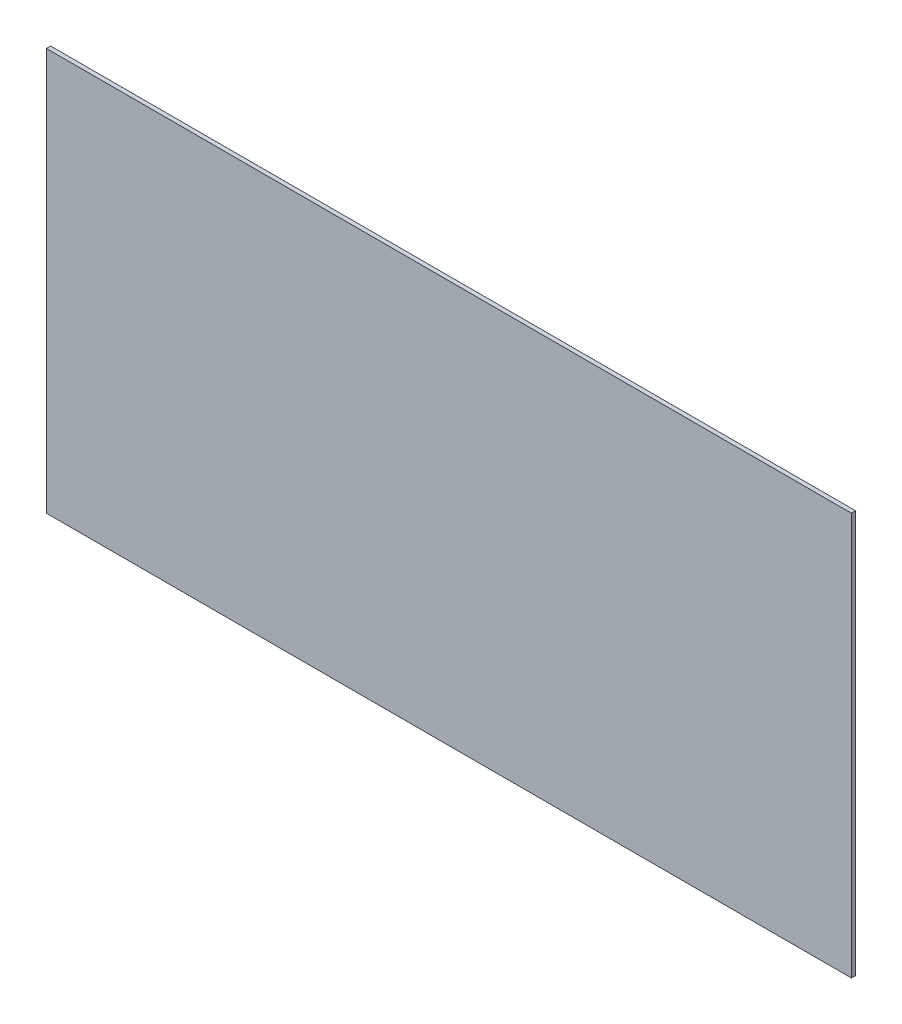
ISO-10303-21;
HEADER;
FILE_DESCRIPTION(('STEP AP214'),'2;1');
FILE_NAME('part.step','',(''),(''),'','','');
FILE_SCHEMA(('AUTOMOTIVE_DESIGN { 1 0 10303 214 1 1 1 1 }'));
ENDSEC;
DATA;
#1=APPLICATION_CONTEXT('core data for automotive mechanical design processes');
#2=APPLICATION_PROTOCOL_DEFINITION('international standard','automotive_design',2000,#1);
#3=PRODUCT_CONTEXT('',#1,'mechanical');
#4=PRODUCT('Part','Part','',(#3));
#5=PRODUCT_RELATED_PRODUCT_CATEGORY('part','',(#4));
#6=PRODUCT_DEFINITION_FORMATION('','',#4);
#7=PRODUCT_DEFINITION_CONTEXT('part definition',#1,'design');
#8=PRODUCT_DEFINITION('design','',#6,#7);
#9=PRODUCT_DEFINITION_SHAPE('','',#8);
#10=(LENGTH_UNIT() NAMED_UNIT(*) SI_UNIT(.MILLI.,.METRE.));
#11=(NAMED_UNIT(*) PLANE_ANGLE_UNIT() SI_UNIT($,.RADIAN.));
#12=(NAMED_UNIT(*) SI_UNIT($,.STERADIAN.) SOLID_ANGLE_UNIT());
#13=UNCERTAINTY_MEASURE_WITH_UNIT(LENGTH_MEASURE(1.E-05),#10,'distance_accuracy_value','');
#14=(GEOMETRIC_REPRESENTATION_CONTEXT(3) GLOBAL_UNCERTAINTY_ASSIGNED_CONTEXT((#13)) GLOBAL_UNIT_ASSIGNED_CONTEXT((#10,
#11,#12)) REPRESENTATION_CONTEXT('',''));
#15=CARTESIAN_POINT('',(0.,0.,0.));
#16=DIRECTION('',(0.,0.,1.));
#17=DIRECTION('',(1.,0.,0.));
#18=AXIS2_PLACEMENT_3D('',#15,#16,#17);
#19=CARTESIAN_POINT('',(-304.8,-152.4,1.5875));
#20=DIRECTION('',(0.,1.,0.));
#21=DIRECTION('',(0.,0.,1.));
#22=AXIS2_PLACEMENT_3D('',#19,#20,#21);
#23=PLANE('',#22);
#24=DIRECTION('',(1.,0.,0.));
#25=VECTOR('',#24,1.);
#26=CARTESIAN_POINT('',(-304.8,-152.4,-1.5875));
#27=LINE('',#26,#25);
#28=CARTESIAN_POINT('',(-304.8,-152.4,-1.5875));
#29=VERTEX_POINT('',#28);
#30=CARTESIAN_POINT('',(304.8,-152.4,-1.5875));
#31=VERTEX_POINT('',#30);
#32=EDGE_CURVE('E109',#29,#31,#27,.T.);
#33=ORIENTED_EDGE('',*,*,#32,.T.);
#34=DIRECTION('',(0.,0.,-1.));
#35=VECTOR('',#34,1.);
#36=CARTESIAN_POINT('',(304.8,-152.4,1.5875));
#37=LINE('',#36,#35);
#38=CARTESIAN_POINT('',(304.8,-152.4,1.5875));
#39=VERTEX_POINT('',#38);
#40=EDGE_CURVE('E11',#39,#31,#37,.T.);
#41=ORIENTED_EDGE('',*,*,#40,.F.);
#42=DIRECTION('',(1.,0.,0.));
#43=VECTOR('',#42,1.);
#44=CARTESIAN_POINT('',(-304.8,-152.4,1.5875));
#45=LINE('',#44,#43);
#46=CARTESIAN_POINT('',(-304.8,-152.4,1.5875));
#47=VERTEX_POINT('',#46);
#48=EDGE_CURVE('E93',#47,#39,#45,.T.);
#49=ORIENTED_EDGE('',*,*,#48,.F.);
#50=DIRECTION('',(0.,0.,-1.));
#51=VECTOR('',#50,1.);
#52=CARTESIAN_POINT('',(-304.8,-152.4,1.5875));
#53=LINE('',#52,#51);
#54=EDGE_CURVE('E105',#47,#29,#53,.T.);
#55=ORIENTED_EDGE('',*,*,#54,.T.);
#56=EDGE_LOOP('',(#33,#41,#49,#55));
#57=FACE_BOUND('',#56,.T.);
#58=ADVANCED_FACE('F41',(#57),#23,.F.);
#59=CARTESIAN_POINT('',(304.8,-152.4,1.5875));
#60=DIRECTION('',(-1.,0.,0.));
#61=DIRECTION('',(0.,0.,1.));
#62=AXIS2_PLACEMENT_3D('',#59,#60,#61);
#63=PLANE('',#62);
#64=DIRECTION('',(0.,1.,0.));
#65=VECTOR('',#64,1.);
#66=CARTESIAN_POINT('',(304.8,-152.4,-1.5875));
#67=LINE('',#66,#65);
#68=CARTESIAN_POINT('',(304.8,152.4,-1.5875));
#69=VERTEX_POINT('',#68);
#70=EDGE_CURVE('E98',#31,#69,#67,.T.);
#71=ORIENTED_EDGE('',*,*,#70,.T.);
#72=DIRECTION('',(0.,0.,-1.));
#73=VECTOR('',#72,1.);
#74=CARTESIAN_POINT('',(304.8,152.4,1.5875));
#75=LINE('',#74,#73);
#76=CARTESIAN_POINT('',(304.8,152.4,1.5875));
#77=VERTEX_POINT('',#76);
#78=EDGE_CURVE('E50',#77,#69,#75,.T.);
#79=ORIENTED_EDGE('',*,*,#78,.F.);
#80=DIRECTION('',(0.,1.,0.));
#81=VECTOR('',#80,1.);
#82=CARTESIAN_POINT('',(304.8,-152.4,1.5875));
#83=LINE('',#82,#81);
#84=EDGE_CURVE('E88',#39,#77,#83,.T.);
#85=ORIENTED_EDGE('',*,*,#84,.F.);
#86=ORIENTED_EDGE('',*,*,#40,.T.);
#87=EDGE_LOOP('',(#71,#79,#85,#86));
#88=FACE_BOUND('',#87,.T.);
#89=ADVANCED_FACE('F97',(#88),#63,.F.);
#90=CARTESIAN_POINT('',(-304.8,152.4,1.5875));
#91=DIRECTION('',(0.,-1.,0.));
#92=DIRECTION('',(0.,0.,-1.));
#93=AXIS2_PLACEMENT_3D('',#90,#91,#92);
#94=PLANE('',#93);
#95=DIRECTION('',(-1.,0.,0.));
#96=VECTOR('',#95,1.);
#97=CARTESIAN_POINT('',(-304.8,152.4,-1.5875));
#98=LINE('',#97,#96);
#99=CARTESIAN_POINT('',(-304.8,152.4,-1.5875));
#100=VERTEX_POINT('',#99);
#101=EDGE_CURVE('E75',#69,#100,#98,.T.);
#102=ORIENTED_EDGE('',*,*,#101,.T.);
#103=DIRECTION('',(0.,0.,-1.));
#104=VECTOR('',#103,1.);
#105=CARTESIAN_POINT('',(-304.8,152.4,1.5875));
#106=LINE('',#105,#104);
#107=CARTESIAN_POINT('',(-304.8,152.4,1.5875));
#108=VERTEX_POINT('',#107);
#109=EDGE_CURVE('E100',#108,#100,#106,.T.);
#110=ORIENTED_EDGE('',*,*,#109,.F.);
#111=DIRECTION('',(-1.,0.,0.));
#112=VECTOR('',#111,1.);
#113=CARTESIAN_POINT('',(-304.8,152.4,1.5875));
#114=LINE('',#113,#112);
#115=EDGE_CURVE('E91',#77,#108,#114,.T.);
#116=ORIENTED_EDGE('',*,*,#115,.F.);
#117=ORIENTED_EDGE('',*,*,#78,.T.);
#118=EDGE_LOOP('',(#102,#110,#116,#117));
#119=FACE_BOUND('',#118,.T.);
#120=ADVANCED_FACE('F101',(#119),#94,.F.);
#121=CARTESIAN_POINT('',(-304.8,-152.4,1.5875));
#122=DIRECTION('',(1.,0.,0.));
#123=DIRECTION('',(0.,0.,-1.));
#124=AXIS2_PLACEMENT_3D('',#121,#122,#123);
#125=PLANE('',#124);
#126=DIRECTION('',(0.,-1.,0.));
#127=VECTOR('',#126,1.);
#128=CARTESIAN_POINT('',(-304.8,-152.4,-1.5875));
#129=LINE('',#128,#127);
#130=EDGE_CURVE('E81',#100,#29,#129,.T.);
#131=ORIENTED_EDGE('',*,*,#130,.T.);
#132=ORIENTED_EDGE('',*,*,#54,.F.);
#133=DIRECTION('',(0.,-1.,0.));
#134=VECTOR('',#133,1.);
#135=CARTESIAN_POINT('',(-304.8,-152.4,1.5875));
#136=LINE('',#135,#134);
#137=EDGE_CURVE('E58',#108,#47,#136,.T.);
#138=ORIENTED_EDGE('',*,*,#137,.F.);
#139=ORIENTED_EDGE('',*,*,#109,.T.);
#140=EDGE_LOOP('',(#131,#132,#138,#139));
#141=FACE_BOUND('',#140,.T.);
#142=ADVANCED_FACE('F122',(#141),#125,.F.);
#143=CARTESIAN_POINT('',(0.,0.,1.5875));
#144=DIRECTION('',(0.,0.,1.));
#145=DIRECTION('',(1.,0.,0.));
#146=AXIS2_PLACEMENT_3D('',#143,#144,#145);
#147=PLANE('',#146);
#148=ORIENTED_EDGE('',*,*,#48,.T.);
#149=ORIENTED_EDGE('',*,*,#84,.T.);
#150=ORIENTED_EDGE('',*,*,#115,.T.);
#151=ORIENTED_EDGE('',*,*,#137,.T.);
#152=EDGE_LOOP('',(#148,#149,#150,#151));
#153=FACE_BOUND('',#152,.T.);
#154=ADVANCED_FACE('F89',(#153),#147,.T.);
#155=CARTESIAN_POINT('',(0.,0.,-1.5875));
#156=DIRECTION('',(0.,0.,1.));
#157=DIRECTION('',(1.,0.,0.));
#158=AXIS2_PLACEMENT_3D('',#155,#156,#157);
#159=PLANE('',#158);
#160=ORIENTED_EDGE('',*,*,#32,.F.);
#161=ORIENTED_EDGE('',*,*,#130,.F.);
#162=ORIENTED_EDGE('',*,*,#101,.F.);
#163=ORIENTED_EDGE('',*,*,#70,.F.);
#164=EDGE_LOOP('',(#160,#161,#162,#163));
#165=FACE_BOUND('',#164,.T.);
#166=ADVANCED_FACE('F125',(#165),#159,.F.);
#167=CLOSED_SHELL('',(#58,#89,#120,#142,#154,#166));
#168=MANIFOLD_SOLID_BREP('B2',#167);
#169=ADVANCED_BREP_SHAPE_REPRESENTATION('',(#18,#168),#14);
#170=SHAPE_DEFINITION_REPRESENTATION(#9,#169);
ENDSEC;
END-ISO-10303-21;
